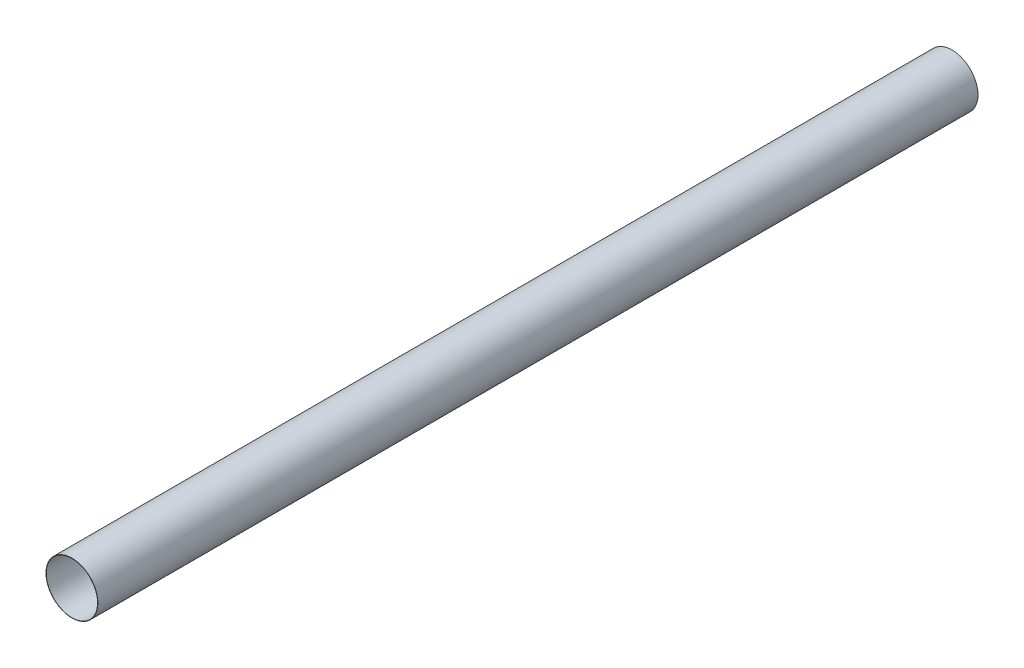
ISO-10303-21;
HEADER;
FILE_DESCRIPTION(('STEP AP214'),'2;1');
FILE_NAME('part.step','',(''),(''),'','','');
FILE_SCHEMA(('AUTOMOTIVE_DESIGN { 1 0 10303 214 1 1 1 1 }'));
ENDSEC;
DATA;
#1=APPLICATION_CONTEXT('core data for automotive mechanical design processes');
#2=APPLICATION_PROTOCOL_DEFINITION('international standard','automotive_design',2000,#1);
#3=PRODUCT_CONTEXT('',#1,'mechanical');
#4=PRODUCT('Part','Part','',(#3));
#5=PRODUCT_RELATED_PRODUCT_CATEGORY('part','',(#4));
#6=PRODUCT_DEFINITION_FORMATION('','',#4);
#7=PRODUCT_DEFINITION_CONTEXT('part definition',#1,'design');
#8=PRODUCT_DEFINITION('design','',#6,#7);
#9=PRODUCT_DEFINITION_SHAPE('','',#8);
#10=(LENGTH_UNIT() NAMED_UNIT(*) SI_UNIT(.MILLI.,.METRE.));
#11=(NAMED_UNIT(*) PLANE_ANGLE_UNIT() SI_UNIT($,.RADIAN.));
#12=(NAMED_UNIT(*) SI_UNIT($,.STERADIAN.) SOLID_ANGLE_UNIT());
#13=UNCERTAINTY_MEASURE_WITH_UNIT(LENGTH_MEASURE(1.E-05),#10,'distance_accuracy_value','');
#14=(GEOMETRIC_REPRESENTATION_CONTEXT(3) GLOBAL_UNCERTAINTY_ASSIGNED_CONTEXT((#13)) GLOBAL_UNIT_ASSIGNED_CONTEXT((#10,
#11,#12)) REPRESENTATION_CONTEXT('',''));
#15=CARTESIAN_POINT('',(0.,0.,0.));
#16=DIRECTION('',(0.,0.,1.));
#17=DIRECTION('',(1.,0.,0.));
#18=AXIS2_PLACEMENT_3D('',#15,#16,#17);
#19=CARTESIAN_POINT('',(0.,0.,300.));
#20=DIRECTION('',(0.,0.,1.));
#21=DIRECTION('',(1.,0.,0.));
#22=AXIS2_PLACEMENT_3D('',#19,#20,#21);
#23=PLANE('',#22);
#24=CARTESIAN_POINT('',(0.,0.,300.));
#25=DIRECTION('',(0.,0.,1.));
#26=DIRECTION('',(1.,0.,0.));
#27=AXIS2_PLACEMENT_3D('',#24,#25,#26);
#28=CIRCLE('',#27,8.85);
#29=CARTESIAN_POINT('',(8.85,0.,300.));
#30=VERTEX_POINT('',#29);
#31=EDGE_CURVE('E10',#30,#30,#28,.T.);
#32=ORIENTED_EDGE('',*,*,#31,.T.);
#33=EDGE_LOOP('',(#32));
#34=FACE_BOUND('',#33,.T.);
#35=CARTESIAN_POINT('',(0.,0.,300.));
#36=DIRECTION('',(0.,0.,1.));
#37=DIRECTION('',(1.,0.,0.));
#38=AXIS2_PLACEMENT_3D('',#35,#36,#37);
#39=CIRCLE('',#38,8.75);
#40=CARTESIAN_POINT('',(8.75,0.,300.));
#41=VERTEX_POINT('',#40);
#42=EDGE_CURVE('E43',#41,#41,#39,.T.);
#43=ORIENTED_EDGE('',*,*,#42,.F.);
#44=EDGE_LOOP('',(#43));
#45=FACE_BOUND('',#44,.T.);
#46=ADVANCED_FACE('F32',(#34,#45),#23,.T.);
#47=CARTESIAN_POINT('',(0.,0.,0.));
#48=DIRECTION('',(0.,0.,1.));
#49=DIRECTION('',(1.,0.,0.));
#50=AXIS2_PLACEMENT_3D('',#47,#48,#49);
#51=PLANE('',#50);
#52=CARTESIAN_POINT('',(0.,0.,0.));
#53=DIRECTION('',(0.,0.,1.));
#54=DIRECTION('',(1.,0.,0.));
#55=AXIS2_PLACEMENT_3D('',#52,#53,#54);
#56=CIRCLE('',#55,8.85);
#57=CARTESIAN_POINT('',(8.85,0.,0.));
#58=VERTEX_POINT('',#57);
#59=EDGE_CURVE('E36',#58,#58,#56,.T.);
#60=ORIENTED_EDGE('',*,*,#59,.F.);
#61=EDGE_LOOP('',(#60));
#62=FACE_BOUND('',#61,.T.);
#63=CARTESIAN_POINT('',(0.,0.,0.));
#64=DIRECTION('',(0.,0.,1.));
#65=DIRECTION('',(1.,0.,0.));
#66=AXIS2_PLACEMENT_3D('',#63,#64,#65);
#67=CIRCLE('',#66,8.75);
#68=CARTESIAN_POINT('',(8.75,0.,0.));
#69=VERTEX_POINT('',#68);
#70=EDGE_CURVE('E45',#69,#69,#67,.T.);
#71=ORIENTED_EDGE('',*,*,#70,.T.);
#72=EDGE_LOOP('',(#71));
#73=FACE_BOUND('',#72,.T.);
#74=ADVANCED_FACE('F55',(#62,#73),#51,.F.);
#75=CARTESIAN_POINT('',(0.,0.,300.));
#76=DIRECTION('',(0.,0.,-1.));
#77=DIRECTION('',(-1.,0.,0.));
#78=AXIS2_PLACEMENT_3D('',#75,#76,#77);
#79=CYLINDRICAL_SURFACE('',#78,8.85);
#80=ORIENTED_EDGE('',*,*,#31,.F.);
#81=EDGE_LOOP('',(#80));
#82=FACE_BOUND('',#81,.T.);
#83=ORIENTED_EDGE('',*,*,#59,.T.);
#84=EDGE_LOOP('',(#83));
#85=FACE_BOUND('',#84,.T.);
#86=ADVANCED_FACE('F34',(#82,#85),#79,.T.);
#87=CARTESIAN_POINT('',(0.,0.,300.));
#88=DIRECTION('',(0.,0.,-1.));
#89=DIRECTION('',(-1.,0.,0.));
#90=AXIS2_PLACEMENT_3D('',#87,#88,#89);
#91=CYLINDRICAL_SURFACE('',#90,8.75);
#92=ORIENTED_EDGE('',*,*,#42,.T.);
#93=EDGE_LOOP('',(#92));
#94=FACE_BOUND('',#93,.T.);
#95=ORIENTED_EDGE('',*,*,#70,.F.);
#96=EDGE_LOOP('',(#95));
#97=FACE_BOUND('',#96,.T.);
#98=ADVANCED_FACE('F51',(#94,#97),#91,.F.);
#99=CLOSED_SHELL('',(#46,#74,#86,#98));
#100=MANIFOLD_SOLID_BREP('B2',#99);
#101=ADVANCED_BREP_SHAPE_REPRESENTATION('',(#18,#100),#14);
#102=SHAPE_DEFINITION_REPRESENTATION(#9,#101);
ENDSEC;
END-ISO-10303-21;
